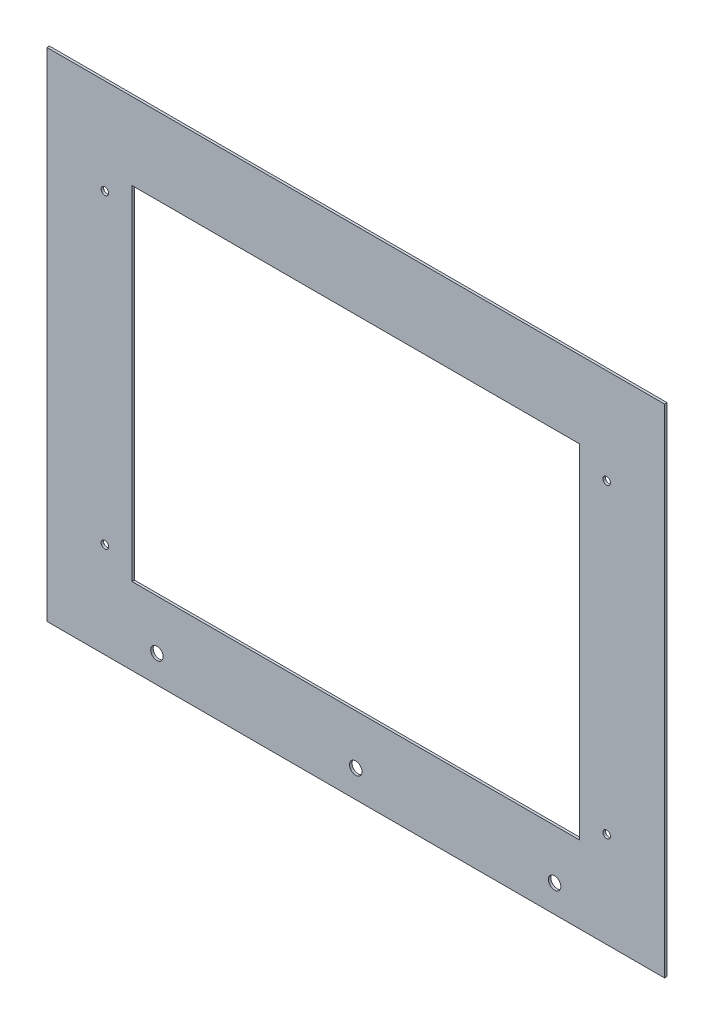
ISO-10303-21;
HEADER;
FILE_DESCRIPTION(('STEP AP214'),'2;1');
FILE_NAME('part.step','',(''),(''),'','','');
FILE_SCHEMA(('AUTOMOTIVE_DESIGN { 1 0 10303 214 1 1 1 1 }'));
ENDSEC;
DATA;
#1=APPLICATION_CONTEXT('core data for automotive mechanical design processes');
#2=APPLICATION_PROTOCOL_DEFINITION('international standard','automotive_design',2000,#1);
#3=PRODUCT_CONTEXT('',#1,'mechanical');
#4=PRODUCT('Part','Part','',(#3));
#5=PRODUCT_RELATED_PRODUCT_CATEGORY('part','',(#4));
#6=PRODUCT_DEFINITION_FORMATION('','',#4);
#7=PRODUCT_DEFINITION_CONTEXT('part definition',#1,'design');
#8=PRODUCT_DEFINITION('design','',#6,#7);
#9=PRODUCT_DEFINITION_SHAPE('','',#8);
#10=(LENGTH_UNIT() NAMED_UNIT(*) SI_UNIT(.MILLI.,.METRE.));
#11=(NAMED_UNIT(*) PLANE_ANGLE_UNIT() SI_UNIT($,.RADIAN.));
#12=(NAMED_UNIT(*) SI_UNIT($,.STERADIAN.) SOLID_ANGLE_UNIT());
#13=UNCERTAINTY_MEASURE_WITH_UNIT(LENGTH_MEASURE(1.E-05),#10,'distance_accuracy_value','');
#14=(GEOMETRIC_REPRESENTATION_CONTEXT(3) GLOBAL_UNCERTAINTY_ASSIGNED_CONTEXT((#13)) GLOBAL_UNIT_ASSIGNED_CONTEXT((#10,
#11,#12)) REPRESENTATION_CONTEXT('',''));
#15=CARTESIAN_POINT('',(0.,0.,0.));
#16=DIRECTION('',(0.,0.,1.));
#17=DIRECTION('',(1.,0.,0.));
#18=AXIS2_PLACEMENT_3D('',#15,#16,#17);
#19=CARTESIAN_POINT('',(0.,0.,0.5));
#20=DIRECTION('',(0.,0.,-1.));
#21=DIRECTION('',(-1.,0.,0.));
#22=AXIS2_PLACEMENT_3D('',#19,#20,#21);
#23=PLANE('',#22);
#24=CARTESIAN_POINT('',(44.25,11.,0.5));
#25=DIRECTION('',(0.,0.,1.));
#26=DIRECTION('',(1.,0.,0.));
#27=AXIS2_PLACEMENT_3D('',#24,#25,#26);
#28=CIRCLE('',#27,2.49999999999999);
#29=CARTESIAN_POINT('',(46.75,11.,0.5));
#30=VERTEX_POINT('',#29);
#31=EDGE_CURVE('E137',#30,#30,#28,.T.);
#32=ORIENTED_EDGE('',*,*,#31,.F.);
#33=EDGE_LOOP('',(#32));
#34=FACE_BOUND('',#33,.T.);
#35=CARTESIAN_POINT('',(204.25,11.,0.5));
#36=DIRECTION('',(0.,0.,1.));
#37=DIRECTION('',(1.,0.,0.));
#38=AXIS2_PLACEMENT_3D('',#35,#36,#37);
#39=CIRCLE('',#38,2.5);
#40=CARTESIAN_POINT('',(206.75,11.,0.5));
#41=VERTEX_POINT('',#40);
#42=EDGE_CURVE('E143',#41,#41,#39,.T.);
#43=ORIENTED_EDGE('',*,*,#42,.F.);
#44=EDGE_LOOP('',(#43));
#45=FACE_BOUND('',#44,.T.);
#46=CARTESIAN_POINT('',(124.25,11.,0.5));
#47=DIRECTION('',(0.,0.,1.));
#48=DIRECTION('',(1.,0.,0.));
#49=AXIS2_PLACEMENT_3D('',#46,#47,#48);
#50=CIRCLE('',#49,2.5);
#51=CARTESIAN_POINT('',(126.75,11.,0.5));
#52=VERTEX_POINT('',#51);
#53=EDGE_CURVE('E149',#52,#52,#50,.T.);
#54=ORIENTED_EDGE('',*,*,#53,.F.);
#55=EDGE_LOOP('',(#54));
#56=FACE_BOUND('',#55,.T.);
#57=DIRECTION('',(0.,-1.,0.));
#58=VECTOR('',#57,1.);
#59=CARTESIAN_POINT('',(0.,0.,0.5));
#60=LINE('',#59,#58);
#61=CARTESIAN_POINT('',(0.,200.,0.5));
#62=VERTEX_POINT('',#61);
#63=CARTESIAN_POINT('',(0.,0.,0.5));
#64=VERTEX_POINT('',#63);
#65=EDGE_CURVE('E155',#62,#64,#60,.T.);
#66=ORIENTED_EDGE('',*,*,#65,.T.);
#67=DIRECTION('',(1.,0.,0.));
#68=VECTOR('',#67,1.);
#69=CARTESIAN_POINT('',(0.,0.,0.5));
#70=LINE('',#69,#68);
#71=CARTESIAN_POINT('',(248.5,0.,0.5));
#72=VERTEX_POINT('',#71);
#73=EDGE_CURVE('E158',#64,#72,#70,.T.);
#74=ORIENTED_EDGE('',*,*,#73,.T.);
#75=DIRECTION('',(0.,1.,0.));
#76=VECTOR('',#75,1.);
#77=CARTESIAN_POINT('',(248.5,0.,0.5));
#78=LINE('',#77,#76);
#79=CARTESIAN_POINT('',(248.5,200.,0.5));
#80=VERTEX_POINT('',#79);
#81=EDGE_CURVE('E161',#72,#80,#78,.T.);
#82=ORIENTED_EDGE('',*,*,#81,.T.);
#83=DIRECTION('',(-1.,0.,0.));
#84=VECTOR('',#83,1.);
#85=CARTESIAN_POINT('',(0.,200.,0.5));
#86=LINE('',#85,#84);
#87=EDGE_CURVE('E163',#80,#62,#86,.T.);
#88=ORIENTED_EDGE('',*,*,#87,.T.);
#89=EDGE_LOOP('',(#66,#74,#82,#88));
#90=FACE_BOUND('',#89,.T.);
#91=DIRECTION('',(0.,-1.,0.));
#92=VECTOR('',#91,1.);
#93=CARTESIAN_POINT('',(34.25,31.,0.5));
#94=LINE('',#93,#92);
#95=CARTESIAN_POINT('',(34.25,169.,0.5));
#96=VERTEX_POINT('',#95);
#97=CARTESIAN_POINT('',(34.25,31.,0.5));
#98=VERTEX_POINT('',#97);
#99=EDGE_CURVE('E98',#96,#98,#94,.T.);
#100=ORIENTED_EDGE('',*,*,#99,.F.);
#101=DIRECTION('',(-1.,0.,0.));
#102=VECTOR('',#101,1.);
#103=CARTESIAN_POINT('',(34.25,169.,0.5));
#104=LINE('',#103,#102);
#105=CARTESIAN_POINT('',(214.25,169.,0.5));
#106=VERTEX_POINT('',#105);
#107=EDGE_CURVE('E121',#106,#96,#104,.T.);
#108=ORIENTED_EDGE('',*,*,#107,.F.);
#109=DIRECTION('',(0.,1.,0.));
#110=VECTOR('',#109,1.);
#111=CARTESIAN_POINT('',(214.25,31.,0.5));
#112=LINE('',#111,#110);
#113=CARTESIAN_POINT('',(214.25,31.,0.5));
#114=VERTEX_POINT('',#113);
#115=EDGE_CURVE('E119',#114,#106,#112,.T.);
#116=ORIENTED_EDGE('',*,*,#115,.F.);
#117=DIRECTION('',(1.,0.,0.));
#118=VECTOR('',#117,1.);
#119=CARTESIAN_POINT('',(34.25,31.,0.5));
#120=LINE('',#119,#118);
#121=EDGE_CURVE('E106',#98,#114,#120,.T.);
#122=ORIENTED_EDGE('',*,*,#121,.F.);
#123=EDGE_LOOP('',(#100,#108,#116,#122));
#124=FACE_BOUND('',#123,.T.);
#125=CARTESIAN_POINT('',(225.215,161.595,0.5));
#126=DIRECTION('',(0.,0.,1.));
#127=DIRECTION('',(1.,0.,0.));
#128=AXIS2_PLACEMENT_3D('',#125,#126,#127);
#129=CIRCLE('',#128,1.5);
#130=CARTESIAN_POINT('',(226.715,161.595,0.5));
#131=VERTEX_POINT('',#130);
#132=EDGE_CURVE('E127',#131,#131,#129,.T.);
#133=ORIENTED_EDGE('',*,*,#132,.F.);
#134=EDGE_LOOP('',(#133));
#135=FACE_BOUND('',#134,.T.);
#136=CARTESIAN_POINT('',(225.215,38.405,0.5));
#137=DIRECTION('',(0.,0.,1.));
#138=DIRECTION('',(1.,0.,0.));
#139=AXIS2_PLACEMENT_3D('',#136,#137,#138);
#140=CIRCLE('',#139,1.5);
#141=CARTESIAN_POINT('',(226.715,38.405,0.5));
#142=VERTEX_POINT('',#141);
#143=EDGE_CURVE('E256',#142,#142,#140,.T.);
#144=ORIENTED_EDGE('',*,*,#143,.F.);
#145=EDGE_LOOP('',(#144));
#146=FACE_BOUND('',#145,.T.);
#147=CARTESIAN_POINT('',(23.285,38.405,0.5));
#148=DIRECTION('',(0.,0.,1.));
#149=DIRECTION('',(-1.,0.,0.));
#150=AXIS2_PLACEMENT_3D('',#147,#148,#149);
#151=CIRCLE('',#150,1.5);
#152=CARTESIAN_POINT('',(21.785,38.405,0.5));
#153=VERTEX_POINT('',#152);
#154=EDGE_CURVE('E251',#153,#153,#151,.T.);
#155=ORIENTED_EDGE('',*,*,#154,.F.);
#156=EDGE_LOOP('',(#155));
#157=FACE_BOUND('',#156,.T.);
#158=CARTESIAN_POINT('',(23.285,161.595,0.5));
#159=DIRECTION('',(0.,0.,1.));
#160=DIRECTION('',(-1.,0.,0.));
#161=AXIS2_PLACEMENT_3D('',#158,#159,#160);
#162=CIRCLE('',#161,1.5);
#163=CARTESIAN_POINT('',(21.785,161.595,0.5));
#164=VERTEX_POINT('',#163);
#165=EDGE_CURVE('E245',#164,#164,#162,.T.);
#166=ORIENTED_EDGE('',*,*,#165,.F.);
#167=EDGE_LOOP('',(#166));
#168=FACE_BOUND('',#167,.T.);
#169=ADVANCED_FACE('F33',(#34,#45,#56,#90,#124,#135,#146,#157,#168),#23,.F.);
#170=CARTESIAN_POINT('',(0.,0.,-0.5));
#171=DIRECTION('',(0.,0.,-1.));
#172=DIRECTION('',(-1.,0.,0.));
#173=AXIS2_PLACEMENT_3D('',#170,#171,#172);
#174=PLANE('',#173);
#175=CARTESIAN_POINT('',(23.285,38.405,-0.5));
#176=DIRECTION('',(0.,0.,1.));
#177=DIRECTION('',(-1.,0.,0.));
#178=AXIS2_PLACEMENT_3D('',#175,#176,#177);
#179=CIRCLE('',#178,1.5);
#180=CARTESIAN_POINT('',(21.785,38.405,-0.5));
#181=VERTEX_POINT('',#180);
#182=EDGE_CURVE('E248',#181,#181,#179,.T.);
#183=ORIENTED_EDGE('',*,*,#182,.T.);
#184=EDGE_LOOP('',(#183));
#185=FACE_BOUND('',#184,.T.);
#186=CARTESIAN_POINT('',(225.215,161.595,-0.5));
#187=DIRECTION('',(0.,0.,1.));
#188=DIRECTION('',(1.,0.,0.));
#189=AXIS2_PLACEMENT_3D('',#186,#187,#188);
#190=CIRCLE('',#189,1.5);
#191=CARTESIAN_POINT('',(226.715,161.595,-0.5));
#192=VERTEX_POINT('',#191);
#193=EDGE_CURVE('E259',#192,#192,#190,.T.);
#194=ORIENTED_EDGE('',*,*,#193,.T.);
#195=EDGE_LOOP('',(#194));
#196=FACE_BOUND('',#195,.T.);
#197=CARTESIAN_POINT('',(204.25,11.,-0.5));
#198=DIRECTION('',(0.,0.,1.));
#199=DIRECTION('',(1.,0.,0.));
#200=AXIS2_PLACEMENT_3D('',#197,#198,#199);
#201=CIRCLE('',#200,2.5);
#202=CARTESIAN_POINT('',(206.75,11.,-0.5));
#203=VERTEX_POINT('',#202);
#204=EDGE_CURVE('E140',#203,#203,#201,.T.);
#205=ORIENTED_EDGE('',*,*,#204,.T.);
#206=EDGE_LOOP('',(#205));
#207=FACE_BOUND('',#206,.T.);
#208=DIRECTION('',(0.,-1.,0.));
#209=VECTOR('',#208,1.);
#210=CARTESIAN_POINT('',(0.,0.,-0.5));
#211=LINE('',#210,#209);
#212=CARTESIAN_POINT('',(0.,200.,-0.5));
#213=VERTEX_POINT('',#212);
#214=CARTESIAN_POINT('',(0.,0.,-0.5));
#215=VERTEX_POINT('',#214);
#216=EDGE_CURVE('E152',#213,#215,#211,.T.);
#217=ORIENTED_EDGE('',*,*,#216,.F.);
#218=DIRECTION('',(-1.,0.,0.));
#219=VECTOR('',#218,1.);
#220=CARTESIAN_POINT('',(0.,200.,-0.5));
#221=LINE('',#220,#219);
#222=CARTESIAN_POINT('',(248.5,200.,-0.5));
#223=VERTEX_POINT('',#222);
#224=EDGE_CURVE('E159',#223,#213,#221,.T.);
#225=ORIENTED_EDGE('',*,*,#224,.F.);
#226=DIRECTION('',(0.,1.,0.));
#227=VECTOR('',#226,1.);
#228=CARTESIAN_POINT('',(248.5,0.,-0.5));
#229=LINE('',#228,#227);
#230=CARTESIAN_POINT('',(248.5,0.,-0.5));
#231=VERTEX_POINT('',#230);
#232=EDGE_CURVE('E170',#231,#223,#229,.T.);
#233=ORIENTED_EDGE('',*,*,#232,.F.);
#234=DIRECTION('',(1.,0.,0.));
#235=VECTOR('',#234,1.);
#236=CARTESIAN_POINT('',(0.,0.,-0.5));
#237=LINE('',#236,#235);
#238=EDGE_CURVE('E168',#215,#231,#237,.T.);
#239=ORIENTED_EDGE('',*,*,#238,.F.);
#240=EDGE_LOOP('',(#217,#225,#233,#239));
#241=FACE_BOUND('',#240,.T.);
#242=CARTESIAN_POINT('',(124.25,11.,-0.5));
#243=DIRECTION('',(0.,0.,1.));
#244=DIRECTION('',(1.,0.,0.));
#245=AXIS2_PLACEMENT_3D('',#242,#243,#244);
#246=CIRCLE('',#245,2.5);
#247=CARTESIAN_POINT('',(126.75,11.,-0.5));
#248=VERTEX_POINT('',#247);
#249=EDGE_CURVE('E146',#248,#248,#246,.T.);
#250=ORIENTED_EDGE('',*,*,#249,.T.);
#251=EDGE_LOOP('',(#250));
#252=FACE_BOUND('',#251,.T.);
#253=CARTESIAN_POINT('',(44.25,11.,-0.5));
#254=DIRECTION('',(0.,0.,1.));
#255=DIRECTION('',(1.,0.,0.));
#256=AXIS2_PLACEMENT_3D('',#253,#254,#255);
#257=CIRCLE('',#256,2.49999999999999);
#258=CARTESIAN_POINT('',(46.75,11.,-0.5));
#259=VERTEX_POINT('',#258);
#260=EDGE_CURVE('E114',#259,#259,#257,.T.);
#261=ORIENTED_EDGE('',*,*,#260,.T.);
#262=EDGE_LOOP('',(#261));
#263=FACE_BOUND('',#262,.T.);
#264=DIRECTION('',(-1.,0.,0.));
#265=VECTOR('',#264,1.);
#266=CARTESIAN_POINT('',(34.25,169.,-0.5));
#267=LINE('',#266,#265);
#268=CARTESIAN_POINT('',(214.25,169.,-0.5));
#269=VERTEX_POINT('',#268);
#270=CARTESIAN_POINT('',(34.25,169.,-0.5));
#271=VERTEX_POINT('',#270);
#272=EDGE_CURVE('E107',#269,#271,#267,.T.);
#273=ORIENTED_EDGE('',*,*,#272,.T.);
#274=DIRECTION('',(0.,-1.,0.));
#275=VECTOR('',#274,1.);
#276=CARTESIAN_POINT('',(34.25,31.,-0.5));
#277=LINE('',#276,#275);
#278=CARTESIAN_POINT('',(34.25,31.,-0.5));
#279=VERTEX_POINT('',#278);
#280=EDGE_CURVE('E56',#271,#279,#277,.T.);
#281=ORIENTED_EDGE('',*,*,#280,.T.);
#282=DIRECTION('',(1.,0.,0.));
#283=VECTOR('',#282,1.);
#284=CARTESIAN_POINT('',(34.25,31.,-0.5));
#285=LINE('',#284,#283);
#286=CARTESIAN_POINT('',(214.25,31.,-0.5));
#287=VERTEX_POINT('',#286);
#288=EDGE_CURVE('E113',#279,#287,#285,.T.);
#289=ORIENTED_EDGE('',*,*,#288,.T.);
#290=DIRECTION('',(0.,1.,0.));
#291=VECTOR('',#290,1.);
#292=CARTESIAN_POINT('',(214.25,31.,-0.5));
#293=LINE('',#292,#291);
#294=EDGE_CURVE('E129',#287,#269,#293,.T.);
#295=ORIENTED_EDGE('',*,*,#294,.T.);
#296=EDGE_LOOP('',(#273,#281,#289,#295));
#297=FACE_BOUND('',#296,.T.);
#298=CARTESIAN_POINT('',(225.215,38.405,-0.5));
#299=DIRECTION('',(0.,0.,1.));
#300=DIRECTION('',(1.,0.,0.));
#301=AXIS2_PLACEMENT_3D('',#298,#299,#300);
#302=CIRCLE('',#301,1.5);
#303=CARTESIAN_POINT('',(226.715,38.405,-0.5));
#304=VERTEX_POINT('',#303);
#305=EDGE_CURVE('E240',#304,#304,#302,.T.);
#306=ORIENTED_EDGE('',*,*,#305,.T.);
#307=EDGE_LOOP('',(#306));
#308=FACE_BOUND('',#307,.T.);
#309=CARTESIAN_POINT('',(23.285,161.595,-0.5));
#310=DIRECTION('',(0.,0.,1.));
#311=DIRECTION('',(-1.,0.,0.));
#312=AXIS2_PLACEMENT_3D('',#309,#310,#311);
#313=CIRCLE('',#312,1.5);
#314=CARTESIAN_POINT('',(21.785,161.595,-0.5));
#315=VERTEX_POINT('',#314);
#316=EDGE_CURVE('E243',#315,#315,#313,.T.);
#317=ORIENTED_EDGE('',*,*,#316,.T.);
#318=EDGE_LOOP('',(#317));
#319=FACE_BOUND('',#318,.T.);
#320=ADVANCED_FACE('F188',(#185,#196,#207,#241,#252,#263,#297,#308,#319),#174,.T.);
#321=CARTESIAN_POINT('',(0.,0.,0.5));
#322=DIRECTION('',(1.,0.,0.));
#323=DIRECTION('',(0.,0.,-1.));
#324=AXIS2_PLACEMENT_3D('',#321,#322,#323);
#325=PLANE('',#324);
#326=ORIENTED_EDGE('',*,*,#216,.T.);
#327=DIRECTION('',(0.,0.,-1.));
#328=VECTOR('',#327,1.);
#329=CARTESIAN_POINT('',(0.,0.,0.5));
#330=LINE('',#329,#328);
#331=EDGE_CURVE('E11',#64,#215,#330,.T.);
#332=ORIENTED_EDGE('',*,*,#331,.F.);
#333=ORIENTED_EDGE('',*,*,#65,.F.);
#334=DIRECTION('',(0.,0.,-1.));
#335=VECTOR('',#334,1.);
#336=CARTESIAN_POINT('',(0.,200.,0.5));
#337=LINE('',#336,#335);
#338=EDGE_CURVE('E165',#62,#213,#337,.T.);
#339=ORIENTED_EDGE('',*,*,#338,.T.);
#340=EDGE_LOOP('',(#326,#332,#333,#339));
#341=FACE_BOUND('',#340,.T.);
#342=ADVANCED_FACE('F35',(#341),#325,.F.);
#343=CARTESIAN_POINT('',(0.,0.,0.5));
#344=DIRECTION('',(0.,1.,0.));
#345=DIRECTION('',(0.,0.,1.));
#346=AXIS2_PLACEMENT_3D('',#343,#344,#345);
#347=PLANE('',#346);
#348=ORIENTED_EDGE('',*,*,#238,.T.);
#349=DIRECTION('',(0.,0.,-1.));
#350=VECTOR('',#349,1.);
#351=CARTESIAN_POINT('',(248.5,0.,0.5));
#352=LINE('',#351,#350);
#353=EDGE_CURVE('E41',#72,#231,#352,.T.);
#354=ORIENTED_EDGE('',*,*,#353,.F.);
#355=ORIENTED_EDGE('',*,*,#73,.F.);
#356=ORIENTED_EDGE('',*,*,#331,.T.);
#357=EDGE_LOOP('',(#348,#354,#355,#356));
#358=FACE_BOUND('',#357,.T.);
#359=ADVANCED_FACE('F198',(#358),#347,.F.);
#360=CARTESIAN_POINT('',(248.5,0.,0.5));
#361=DIRECTION('',(-1.,0.,0.));
#362=DIRECTION('',(0.,-1.,0.));
#363=AXIS2_PLACEMENT_3D('',#360,#361,#362);
#364=PLANE('',#363);
#365=ORIENTED_EDGE('',*,*,#232,.T.);
#366=DIRECTION('',(0.,0.,-1.));
#367=VECTOR('',#366,1.);
#368=CARTESIAN_POINT('',(248.5,200.,0.5));
#369=LINE('',#368,#367);
#370=EDGE_CURVE('E175',#80,#223,#369,.T.);
#371=ORIENTED_EDGE('',*,*,#370,.F.);
#372=ORIENTED_EDGE('',*,*,#81,.F.);
#373=ORIENTED_EDGE('',*,*,#353,.T.);
#374=EDGE_LOOP('',(#365,#371,#372,#373));
#375=FACE_BOUND('',#374,.T.);
#376=ADVANCED_FACE('F182',(#375),#364,.F.);
#377=CARTESIAN_POINT('',(0.,200.,0.5));
#378=DIRECTION('',(0.,-1.,0.));
#379=DIRECTION('',(0.,0.,-1.));
#380=AXIS2_PLACEMENT_3D('',#377,#378,#379);
#381=PLANE('',#380);
#382=ORIENTED_EDGE('',*,*,#224,.T.);
#383=ORIENTED_EDGE('',*,*,#338,.F.);
#384=ORIENTED_EDGE('',*,*,#87,.F.);
#385=ORIENTED_EDGE('',*,*,#370,.T.);
#386=EDGE_LOOP('',(#382,#383,#384,#385));
#387=FACE_BOUND('',#386,.T.);
#388=ADVANCED_FACE('F192',(#387),#381,.F.);
#389=CARTESIAN_POINT('',(124.25,11.,0.5));
#390=DIRECTION('',(0.,0.,-1.));
#391=DIRECTION('',(-1.,0.,0.));
#392=AXIS2_PLACEMENT_3D('',#389,#390,#391);
#393=CYLINDRICAL_SURFACE('',#392,2.5);
#394=ORIENTED_EDGE('',*,*,#53,.T.);
#395=EDGE_LOOP('',(#394));
#396=FACE_BOUND('',#395,.T.);
#397=ORIENTED_EDGE('',*,*,#249,.F.);
#398=EDGE_LOOP('',(#397));
#399=FACE_BOUND('',#398,.T.);
#400=ADVANCED_FACE('F216',(#396,#399),#393,.F.);
#401=CARTESIAN_POINT('',(204.25,11.,0.5));
#402=DIRECTION('',(0.,0.,-1.));
#403=DIRECTION('',(-1.,0.,0.));
#404=AXIS2_PLACEMENT_3D('',#401,#402,#403);
#405=CYLINDRICAL_SURFACE('',#404,2.5);
#406=ORIENTED_EDGE('',*,*,#42,.T.);
#407=EDGE_LOOP('',(#406));
#408=FACE_BOUND('',#407,.T.);
#409=ORIENTED_EDGE('',*,*,#204,.F.);
#410=EDGE_LOOP('',(#409));
#411=FACE_BOUND('',#410,.T.);
#412=ADVANCED_FACE('F223',(#408,#411),#405,.F.);
#413=CARTESIAN_POINT('',(44.25,11.,0.5));
#414=DIRECTION('',(0.,0.,-1.));
#415=DIRECTION('',(-1.,0.,0.));
#416=AXIS2_PLACEMENT_3D('',#413,#414,#415);
#417=CYLINDRICAL_SURFACE('',#416,2.49999999999999);
#418=ORIENTED_EDGE('',*,*,#31,.T.);
#419=EDGE_LOOP('',(#418));
#420=FACE_BOUND('',#419,.T.);
#421=ORIENTED_EDGE('',*,*,#260,.F.);
#422=EDGE_LOOP('',(#421));
#423=FACE_BOUND('',#422,.T.);
#424=ADVANCED_FACE('F228',(#420,#423),#417,.F.);
#425=CARTESIAN_POINT('',(34.25,31.,0.5));
#426=DIRECTION('',(1.,0.,0.));
#427=DIRECTION('',(0.,0.,-1.));
#428=AXIS2_PLACEMENT_3D('',#425,#426,#427);
#429=PLANE('',#428);
#430=ORIENTED_EDGE('',*,*,#280,.F.);
#431=DIRECTION('',(0.,0.,-1.));
#432=VECTOR('',#431,1.);
#433=CARTESIAN_POINT('',(34.25,169.,0.5));
#434=LINE('',#433,#432);
#435=EDGE_CURVE('E102',#96,#271,#434,.T.);
#436=ORIENTED_EDGE('',*,*,#435,.F.);
#437=ORIENTED_EDGE('',*,*,#99,.T.);
#438=DIRECTION('',(0.,0.,-1.));
#439=VECTOR('',#438,1.);
#440=CARTESIAN_POINT('',(34.25,31.,0.5));
#441=LINE('',#440,#439);
#442=EDGE_CURVE('E101',#98,#279,#441,.T.);
#443=ORIENTED_EDGE('',*,*,#442,.T.);
#444=EDGE_LOOP('',(#430,#436,#437,#443));
#445=FACE_BOUND('',#444,.T.);
#446=ADVANCED_FACE('F100',(#445),#429,.T.);
#447=CARTESIAN_POINT('',(34.25,31.,0.5));
#448=DIRECTION('',(0.,1.,0.));
#449=DIRECTION('',(0.,0.,1.));
#450=AXIS2_PLACEMENT_3D('',#447,#448,#449);
#451=PLANE('',#450);
#452=ORIENTED_EDGE('',*,*,#288,.F.);
#453=ORIENTED_EDGE('',*,*,#442,.F.);
#454=ORIENTED_EDGE('',*,*,#121,.T.);
#455=DIRECTION('',(0.,0.,-1.));
#456=VECTOR('',#455,1.);
#457=CARTESIAN_POINT('',(214.25,31.,0.5));
#458=LINE('',#457,#456);
#459=EDGE_CURVE('E115',#114,#287,#458,.T.);
#460=ORIENTED_EDGE('',*,*,#459,.T.);
#461=EDGE_LOOP('',(#452,#453,#454,#460));
#462=FACE_BOUND('',#461,.T.);
#463=ADVANCED_FACE('F110',(#462),#451,.T.);
#464=CARTESIAN_POINT('',(214.25,31.,0.5));
#465=DIRECTION('',(-1.,0.,0.));
#466=DIRECTION('',(0.,0.,1.));
#467=AXIS2_PLACEMENT_3D('',#464,#465,#466);
#468=PLANE('',#467);
#469=ORIENTED_EDGE('',*,*,#294,.F.);
#470=ORIENTED_EDGE('',*,*,#459,.F.);
#471=ORIENTED_EDGE('',*,*,#115,.T.);
#472=DIRECTION('',(0.,0.,-1.));
#473=VECTOR('',#472,1.);
#474=CARTESIAN_POINT('',(214.25,169.,0.5));
#475=LINE('',#474,#473);
#476=EDGE_CURVE('E48',#106,#269,#475,.T.);
#477=ORIENTED_EDGE('',*,*,#476,.T.);
#478=EDGE_LOOP('',(#469,#470,#471,#477));
#479=FACE_BOUND('',#478,.T.);
#480=ADVANCED_FACE('F280',(#479),#468,.T.);
#481=CARTESIAN_POINT('',(34.25,169.,0.5));
#482=DIRECTION('',(0.,-1.,0.));
#483=DIRECTION('',(0.,0.,-1.));
#484=AXIS2_PLACEMENT_3D('',#481,#482,#483);
#485=PLANE('',#484);
#486=ORIENTED_EDGE('',*,*,#272,.F.);
#487=ORIENTED_EDGE('',*,*,#476,.F.);
#488=ORIENTED_EDGE('',*,*,#107,.T.);
#489=ORIENTED_EDGE('',*,*,#435,.T.);
#490=EDGE_LOOP('',(#486,#487,#488,#489));
#491=FACE_BOUND('',#490,.T.);
#492=ADVANCED_FACE('F270',(#491),#485,.T.);
#493=CARTESIAN_POINT('',(225.215,161.595,0.5));
#494=DIRECTION('',(0.,0.,-1.));
#495=DIRECTION('',(-1.,0.,0.));
#496=AXIS2_PLACEMENT_3D('',#493,#494,#495);
#497=CYLINDRICAL_SURFACE('',#496,1.5);
#498=ORIENTED_EDGE('',*,*,#132,.T.);
#499=EDGE_LOOP('',(#498));
#500=FACE_BOUND('',#499,.T.);
#501=ORIENTED_EDGE('',*,*,#193,.F.);
#502=EDGE_LOOP('',(#501));
#503=FACE_BOUND('',#502,.T.);
#504=ADVANCED_FACE('F267',(#500,#503),#497,.F.);
#505=CARTESIAN_POINT('',(225.215,38.405,0.5));
#506=DIRECTION('',(0.,0.,-1.));
#507=DIRECTION('',(-1.,0.,0.));
#508=AXIS2_PLACEMENT_3D('',#505,#506,#507);
#509=CYLINDRICAL_SURFACE('',#508,1.5);
#510=ORIENTED_EDGE('',*,*,#143,.T.);
#511=EDGE_LOOP('',(#510));
#512=FACE_BOUND('',#511,.T.);
#513=ORIENTED_EDGE('',*,*,#305,.F.);
#514=EDGE_LOOP('',(#513));
#515=FACE_BOUND('',#514,.T.);
#516=ADVANCED_FACE('F269',(#512,#515),#509,.F.);
#517=CARTESIAN_POINT('',(23.285,38.405,0.5));
#518=DIRECTION('',(0.,0.,-1.));
#519=DIRECTION('',(-1.,0.,0.));
#520=AXIS2_PLACEMENT_3D('',#517,#518,#519);
#521=CYLINDRICAL_SURFACE('',#520,1.5);
#522=ORIENTED_EDGE('',*,*,#154,.T.);
#523=EDGE_LOOP('',(#522));
#524=FACE_BOUND('',#523,.T.);
#525=ORIENTED_EDGE('',*,*,#182,.F.);
#526=EDGE_LOOP('',(#525));
#527=FACE_BOUND('',#526,.T.);
#528=ADVANCED_FACE('F277',(#524,#527),#521,.F.);
#529=CARTESIAN_POINT('',(23.285,161.595,0.5));
#530=DIRECTION('',(0.,0.,-1.));
#531=DIRECTION('',(-1.,0.,0.));
#532=AXIS2_PLACEMENT_3D('',#529,#530,#531);
#533=CYLINDRICAL_SURFACE('',#532,1.5);
#534=ORIENTED_EDGE('',*,*,#165,.T.);
#535=EDGE_LOOP('',(#534));
#536=FACE_BOUND('',#535,.T.);
#537=ORIENTED_EDGE('',*,*,#316,.F.);
#538=EDGE_LOOP('',(#537));
#539=FACE_BOUND('',#538,.T.);
#540=ADVANCED_FACE('F333',(#536,#539),#533,.F.);
#541=CLOSED_SHELL('',(#169,#320,#342,#359,#376,#388,#400,#412,#424,#446,#463,#480,#492,#504,
#516,#528,#540));
#542=MANIFOLD_SOLID_BREP('B2',#541);
#543=ADVANCED_BREP_SHAPE_REPRESENTATION('',(#18,#542),#14);
#544=SHAPE_DEFINITION_REPRESENTATION(#9,#543);
ENDSEC;
END-ISO-10303-21;
